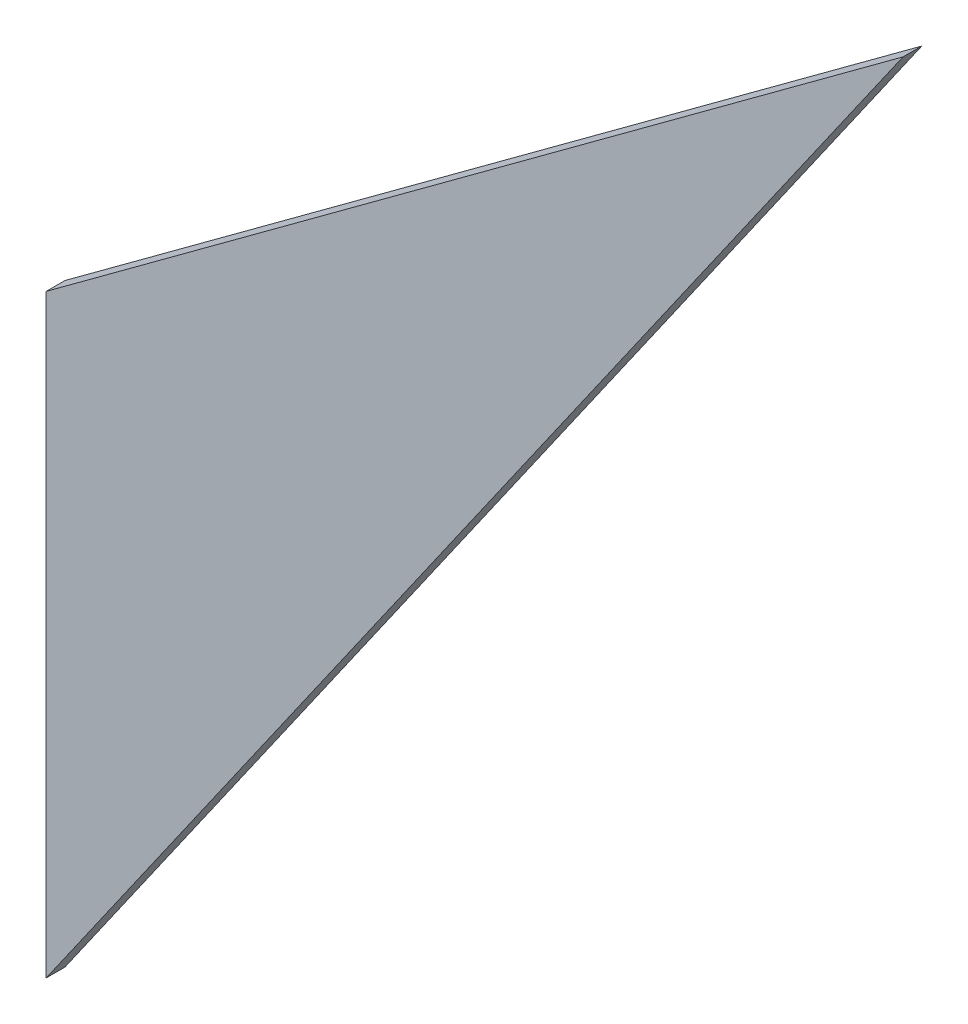
ISO-10303-21;
HEADER;
FILE_DESCRIPTION(('STEP AP214'),'2;1');
FILE_NAME('part.step','',(''),(''),'','','');
FILE_SCHEMA(('AUTOMOTIVE_DESIGN { 1 0 10303 214 1 1 1 1 }'));
ENDSEC;
DATA;
#1=APPLICATION_CONTEXT('core data for automotive mechanical design processes');
#2=APPLICATION_PROTOCOL_DEFINITION('international standard','automotive_design',2000,#1);
#3=PRODUCT_CONTEXT('',#1,'mechanical');
#4=PRODUCT('Part','Part','',(#3));
#5=PRODUCT_RELATED_PRODUCT_CATEGORY('part','',(#4));
#6=PRODUCT_DEFINITION_FORMATION('','',#4);
#7=PRODUCT_DEFINITION_CONTEXT('part definition',#1,'design');
#8=PRODUCT_DEFINITION('design','',#6,#7);
#9=PRODUCT_DEFINITION_SHAPE('','',#8);
#10=(LENGTH_UNIT() NAMED_UNIT(*) SI_UNIT(.MILLI.,.METRE.));
#11=(NAMED_UNIT(*) PLANE_ANGLE_UNIT() SI_UNIT($,.RADIAN.));
#12=(NAMED_UNIT(*) SI_UNIT($,.STERADIAN.) SOLID_ANGLE_UNIT());
#13=UNCERTAINTY_MEASURE_WITH_UNIT(LENGTH_MEASURE(1.E-05),#10,'distance_accuracy_value','');
#14=(GEOMETRIC_REPRESENTATION_CONTEXT(3) GLOBAL_UNCERTAINTY_ASSIGNED_CONTEXT((#13)) GLOBAL_UNIT_ASSIGNED_CONTEXT((#10,
#11,#12)) REPRESENTATION_CONTEXT('',''));
#15=CARTESIAN_POINT('',(0.,0.,0.));
#16=DIRECTION('',(0.,0.,1.));
#17=DIRECTION('',(1.,0.,0.));
#18=AXIS2_PLACEMENT_3D('',#15,#16,#17);
#19=CARTESIAN_POINT('',(0.,473.42,15.));
#20=DIRECTION('',(0.593278397097199,-0.804997356230304,0.));
#21=DIRECTION('',(0.804997356230304,0.593278397097199,0.));
#22=AXIS2_PLACEMENT_3D('',#19,#20,#21);
#23=PLANE('',#22);
#24=DIRECTION('',(-0.804997356230304,-0.593278397097199,0.));
#25=VECTOR('',#24,1.);
#26=CARTESIAN_POINT('',(0.,473.42,0.));
#27=LINE('',#26,#25);
#28=CARTESIAN_POINT('',(682.251359352307,976.235307107818,0.));
#29=VERTEX_POINT('',#28);
#30=CARTESIAN_POINT('',(0.,473.42,0.));
#31=VERTEX_POINT('',#30);
#32=EDGE_CURVE('E83',#29,#31,#27,.T.);
#33=ORIENTED_EDGE('',*,*,#32,.T.);
#34=DIRECTION('',(0.,0.,-1.));
#35=VECTOR('',#34,1.);
#36=CARTESIAN_POINT('',(0.,473.42,15.));
#37=LINE('',#36,#35);
#38=CARTESIAN_POINT('',(0.,473.42,15.));
#39=VERTEX_POINT('',#38);
#40=EDGE_CURVE('E11',#39,#31,#37,.T.);
#41=ORIENTED_EDGE('',*,*,#40,.F.);
#42=DIRECTION('',(-0.804997356230304,-0.593278397097199,0.));
#43=VECTOR('',#42,1.);
#44=CARTESIAN_POINT('',(0.,473.42,15.));
#45=LINE('',#44,#43);
#46=CARTESIAN_POINT('',(682.251359352307,976.235307107818,15.));
#47=VERTEX_POINT('',#46);
#48=EDGE_CURVE('E76',#47,#39,#45,.T.);
#49=ORIENTED_EDGE('',*,*,#48,.F.);
#50=DIRECTION('',(0.,0.,-1.));
#51=VECTOR('',#50,1.);
#52=CARTESIAN_POINT('',(682.251359352307,976.235307107818,15.));
#53=LINE('',#52,#51);
#54=EDGE_CURVE('E84',#47,#29,#53,.T.);
#55=ORIENTED_EDGE('',*,*,#54,.T.);
#56=EDGE_LOOP('',(#33,#41,#49,#55));
#57=FACE_BOUND('',#56,.T.);
#58=ADVANCED_FACE('F36',(#57),#23,.F.);
#59=CARTESIAN_POINT('',(0.,0.,15.));
#60=DIRECTION('',(1.,0.,0.));
#61=DIRECTION('',(0.,0.,-1.));
#62=AXIS2_PLACEMENT_3D('',#59,#60,#61);
#63=PLANE('',#62);
#64=DIRECTION('',(0.,-1.,0.));
#65=VECTOR('',#64,1.);
#66=CARTESIAN_POINT('',(0.,0.,0.));
#67=LINE('',#66,#65);
#68=CARTESIAN_POINT('',(0.,0.,0.));
#69=VERTEX_POINT('',#68);
#70=EDGE_CURVE('E64',#31,#69,#67,.T.);
#71=ORIENTED_EDGE('',*,*,#70,.T.);
#72=DIRECTION('',(0.,0.,-1.));
#73=VECTOR('',#72,1.);
#74=CARTESIAN_POINT('',(0.,0.,15.));
#75=LINE('',#74,#73);
#76=CARTESIAN_POINT('',(0.,0.,15.));
#77=VERTEX_POINT('',#76);
#78=EDGE_CURVE('E44',#77,#69,#75,.T.);
#79=ORIENTED_EDGE('',*,*,#78,.F.);
#80=DIRECTION('',(0.,-1.,0.));
#81=VECTOR('',#80,1.);
#82=CARTESIAN_POINT('',(0.,0.,15.));
#83=LINE('',#82,#81);
#84=EDGE_CURVE('E72',#39,#77,#83,.T.);
#85=ORIENTED_EDGE('',*,*,#84,.F.);
#86=ORIENTED_EDGE('',*,*,#40,.T.);
#87=EDGE_LOOP('',(#71,#79,#85,#86));
#88=FACE_BOUND('',#87,.T.);
#89=ADVANCED_FACE('F73',(#88),#63,.F.);
#90=CARTESIAN_POINT('',(0.,0.,15.));
#91=DIRECTION('',(-0.819670848257912,0.572834793388247,0.));
#92=DIRECTION('',(-0.572834793388247,-0.819670848257912,0.));
#93=AXIS2_PLACEMENT_3D('',#90,#91,#92);
#94=PLANE('',#93);
#95=DIRECTION('',(0.572834793388247,0.819670848257912,0.));
#96=VECTOR('',#95,1.);
#97=CARTESIAN_POINT('',(0.,0.,0.));
#98=LINE('',#97,#96);
#99=EDGE_CURVE('E69',#69,#29,#98,.T.);
#100=ORIENTED_EDGE('',*,*,#99,.T.);
#101=ORIENTED_EDGE('',*,*,#54,.F.);
#102=DIRECTION('',(0.572834793388247,0.819670848257912,0.));
#103=VECTOR('',#102,1.);
#104=CARTESIAN_POINT('',(0.,0.,15.));
#105=LINE('',#104,#103);
#106=EDGE_CURVE('E52',#77,#47,#105,.T.);
#107=ORIENTED_EDGE('',*,*,#106,.F.);
#108=ORIENTED_EDGE('',*,*,#78,.T.);
#109=EDGE_LOOP('',(#100,#101,#107,#108));
#110=FACE_BOUND('',#109,.T.);
#111=ADVANCED_FACE('F91',(#110),#94,.F.);
#112=CARTESIAN_POINT('',(0.,0.,15.));
#113=DIRECTION('',(0.,0.,1.));
#114=DIRECTION('',(1.,0.,0.));
#115=AXIS2_PLACEMENT_3D('',#112,#113,#114);
#116=PLANE('',#115);
#117=ORIENTED_EDGE('',*,*,#48,.T.);
#118=ORIENTED_EDGE('',*,*,#84,.T.);
#119=ORIENTED_EDGE('',*,*,#106,.T.);
#120=EDGE_LOOP('',(#117,#118,#119));
#121=FACE_BOUND('',#120,.T.);
#122=ADVANCED_FACE('F79',(#121),#116,.T.);
#123=CARTESIAN_POINT('',(0.,0.,0.));
#124=DIRECTION('',(0.,0.,1.));
#125=DIRECTION('',(1.,0.,0.));
#126=AXIS2_PLACEMENT_3D('',#123,#124,#125);
#127=PLANE('',#126);
#128=ORIENTED_EDGE('',*,*,#32,.F.);
#129=ORIENTED_EDGE('',*,*,#99,.F.);
#130=ORIENTED_EDGE('',*,*,#70,.F.);
#131=EDGE_LOOP('',(#128,#129,#130));
#132=FACE_BOUND('',#131,.T.);
#133=ADVANCED_FACE('F92',(#132),#127,.F.);
#134=CLOSED_SHELL('',(#58,#89,#111,#122,#133));
#135=MANIFOLD_SOLID_BREP('B2',#134);
#136=ADVANCED_BREP_SHAPE_REPRESENTATION('',(#18,#135),#14);
#137=SHAPE_DEFINITION_REPRESENTATION(#9,#136);
ENDSEC;
END-ISO-10303-21;
